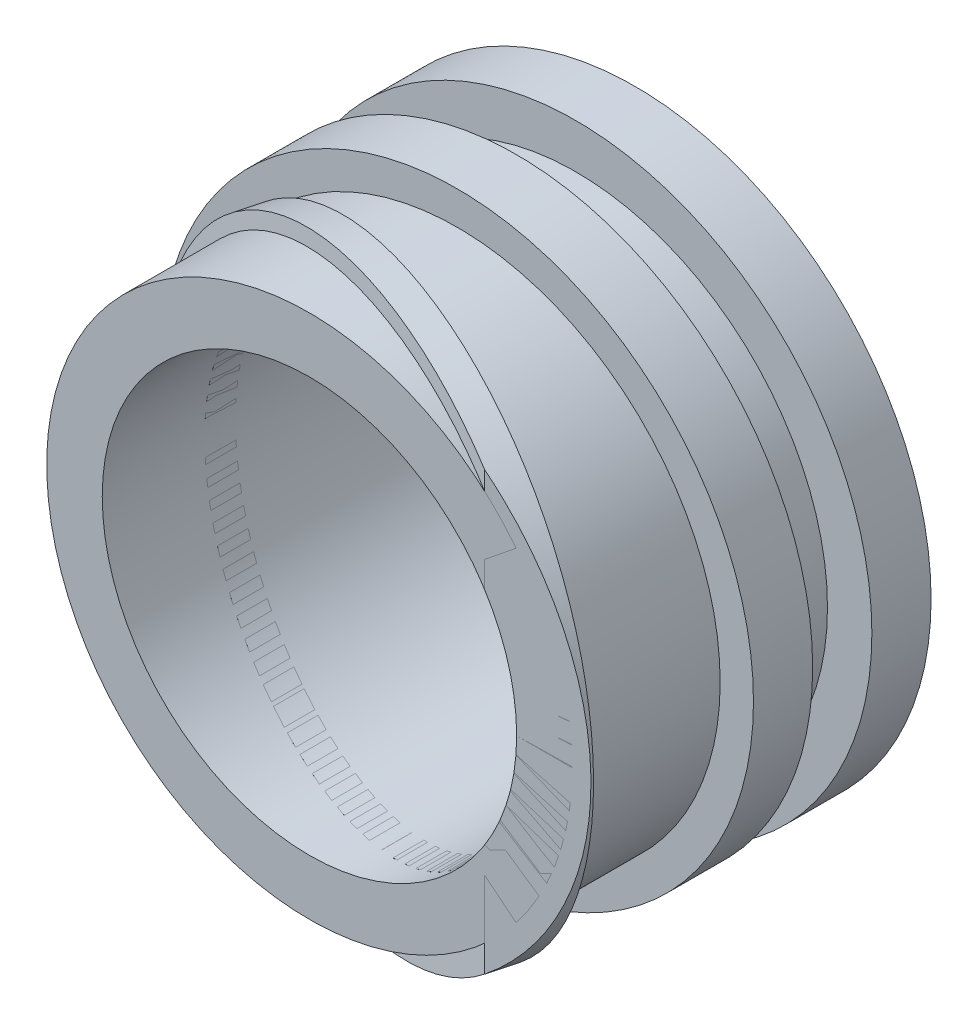
ISO-10303-21;
HEADER;
FILE_DESCRIPTION(('STEP AP214'),'2;1');
FILE_NAME('part.step','',(''),(''),'','','');
FILE_SCHEMA(('AUTOMOTIVE_DESIGN { 1 0 10303 214 1 1 1 1 }'));
ENDSEC;
DATA;
#1=APPLICATION_CONTEXT('core data for automotive mechanical design processes');
#2=APPLICATION_PROTOCOL_DEFINITION('international standard','automotive_design',2000,#1);
#3=PRODUCT_CONTEXT('',#1,'mechanical');
#4=PRODUCT('Part','Part','',(#3));
#5=PRODUCT_RELATED_PRODUCT_CATEGORY('part','',(#4));
#6=PRODUCT_DEFINITION_FORMATION('','',#4);
#7=PRODUCT_DEFINITION_CONTEXT('part definition',#1,'design');
#8=PRODUCT_DEFINITION('design','',#6,#7);
#9=PRODUCT_DEFINITION_SHAPE('','',#8);
#10=(LENGTH_UNIT() NAMED_UNIT(*) SI_UNIT(.MILLI.,.METRE.));
#11=(NAMED_UNIT(*) PLANE_ANGLE_UNIT() SI_UNIT($,.RADIAN.));
#12=(NAMED_UNIT(*) SI_UNIT($,.STERADIAN.) SOLID_ANGLE_UNIT());
#13=UNCERTAINTY_MEASURE_WITH_UNIT(LENGTH_MEASURE(1.E-05),#10,'distance_accuracy_value','');
#14=(GEOMETRIC_REPRESENTATION_CONTEXT(3) GLOBAL_UNCERTAINTY_ASSIGNED_CONTEXT((#13)) GLOBAL_UNIT_ASSIGNED_CONTEXT((#10,
#11,#12)) REPRESENTATION_CONTEXT('',''));
#15=CARTESIAN_POINT('',(0.,0.,0.));
#16=DIRECTION('',(0.,0.,1.));
#17=DIRECTION('',(1.,0.,0.));
#18=AXIS2_PLACEMENT_3D('',#15,#16,#17);
#19=CARTESIAN_POINT('',(0.0136407378455583,-0.133986716540576,9.41698028792618));
#20=DIRECTION('',(-0.258819045102521,0.,0.965925826289068));
#21=DIRECTION('',(0.965925826289068,0.,0.258819045102521));
#22=AXIS2_PLACEMENT_3D('',#19,#20,#21);
#23=PLANE('',#22);
#24=CARTESIAN_POINT('',(0.0136407378455583,-0.133986716540576,9.41698028792618));
#25=DIRECTION('',(-0.258819045102521,0.,0.965925826289068));
#26=DIRECTION('',(0.965925826289068,0.,0.258819045102521));
#27=AXIS2_PLACEMENT_3D('',#24,#25,#26);
#28=CIRCLE('',#27,9.58305954434531);
#29=CARTESIAN_POINT('',(5.92155073268807,7.24338939658348,11.));
#30=VERTEX_POINT('',#29);
#31=CARTESIAN_POINT('',(5.92155073268807,-7.51136282966463,11.));
#32=VERTEX_POINT('',#31);
#33=EDGE_CURVE('E49',#30,#32,#28,.T.);
#34=ORIENTED_EDGE('',*,*,#33,.T.);
#35=DIRECTION('',(0.,1.,0.));
#36=VECTOR('',#35,1.);
#37=CARTESIAN_POINT('',(5.92155073268807,-0.133986716540576,11.));
#38=LINE('',#37,#36);
#39=CARTESIAN_POINT('',(5.92155073268807,-3.73299302439764,11.));
#40=VERTEX_POINT('',#39);
#41=EDGE_CURVE('E60',#32,#40,#38,.T.);
#42=ORIENTED_EDGE('',*,*,#41,.T.);
#43=CARTESIAN_POINT('',(0.,0.,9.4133252632363));
#44=DIRECTION('',(-0.258819045102521,0.,0.965925826289068));
#45=DIRECTION('',(-0.965925826289068,0.,-0.258819045102521));
#46=AXIS2_PLACEMENT_3D('',#43,#44,#45);
#47=ELLIPSE('',#46,7.24693326287058,7.);
#48=CARTESIAN_POINT('',(5.92155073268807,3.73299302439764,11.));
#49=VERTEX_POINT('',#48);
#50=EDGE_CURVE('E71',#40,#49,#47,.F.);
#51=ORIENTED_EDGE('',*,*,#50,.T.);
#52=EDGE_CURVE('E56',#49,#30,#38,.T.);
#53=ORIENTED_EDGE('',*,*,#52,.T.);
#54=EDGE_LOOP('',(#34,#42,#51,#53));
#55=FACE_BOUND('',#54,.T.);
#56=ADVANCED_FACE('F41',(#55),#23,.T.);
#57=CARTESIAN_POINT('',(0.0136407378455583,-0.133986716540576,9.41698028792618));
#58=DIRECTION('',(0.258819045102521,0.,-0.965925826289068));
#59=DIRECTION('',(-0.965925826289068,0.,-0.258819045102521));
#60=AXIS2_PLACEMENT_3D('',#57,#58,#59);
#61=CYLINDRICAL_SURFACE('',#60,9.58305954434531);
#62=CARTESIAN_POINT('',(0.27245978294808,-0.133986716540576,8.45105446163712));
#63=DIRECTION('',(-0.258819045102521,0.,0.965925826289068));
#64=DIRECTION('',(0.965925826289068,0.,0.258819045102521));
#65=AXIS2_PLACEMENT_3D('',#62,#63,#64);
#66=CIRCLE('',#65,9.58305954434531);
#67=CARTESIAN_POINT('',(9.52898449169716,-0.133986716540576,10.9313327820652));
#68=VERTEX_POINT('',#67);
#69=EDGE_CURVE('E76',#68,#68,#66,.T.);
#70=ORIENTED_EDGE('',*,*,#69,.T.);
#71=EDGE_LOOP('',(#70));
#72=FACE_BOUND('',#71,.T.);
#73=CARTESIAN_POINT('',(-0.410528115607169,-0.133986716540576,11.));
#74=DIRECTION('',(0.,0.,1.));
#75=DIRECTION('',(1.,0.,0.));
#76=AXIS2_PLACEMENT_3D('',#73,#74,#75);
#77=ELLIPSE('',#76,9.9211132817122,9.58305954434531);
#78=EDGE_CURVE('E73',#32,#30,#77,.T.);
#79=ORIENTED_EDGE('',*,*,#78,.F.);
#80=ORIENTED_EDGE('',*,*,#33,.F.);
#81=EDGE_LOOP('',(#79,#80));
#82=FACE_BOUND('',#81,.T.);
#83=ADVANCED_FACE('F43',(#72,#82),#61,.T.);
#84=CARTESIAN_POINT('',(0.,0.,11.8972586083542));
#85=DIRECTION('',(0.,0.,-1.));
#86=DIRECTION('',(-1.,0.,0.));
#87=AXIS2_PLACEMENT_3D('',#84,#85,#86);
#88=CYLINDRICAL_SURFACE('',#87,7.);
#89=CARTESIAN_POINT('',(0.,0.,8.37804908282622));
#90=DIRECTION('',(-0.258819045102521,0.,0.965925826289068));
#91=DIRECTION('',(-0.965925826289068,0.,-0.258819045102521));
#92=AXIS2_PLACEMENT_3D('',#89,#90,#91);
#93=ELLIPSE('',#92,7.24693326287058,7.);
#94=CARTESIAN_POINT('',(-7.,0.,6.50240473580835));
#95=VERTEX_POINT('',#94);
#96=EDGE_CURVE('E77',#95,#95,#93,.F.);
#97=ORIENTED_EDGE('',*,*,#96,.T.);
#98=EDGE_LOOP('',(#97));
#99=FACE_BOUND('',#98,.T.);
#100=ORIENTED_EDGE('',*,*,#50,.F.);
#101=CARTESIAN_POINT('',(0.,0.,11.));
#102=DIRECTION('',(0.,0.,1.));
#103=DIRECTION('',(1.,0.,0.));
#104=AXIS2_PLACEMENT_3D('',#101,#102,#103);
#105=CIRCLE('',#104,7.);
#106=EDGE_CURVE('E12',#40,#49,#105,.T.);
#107=ORIENTED_EDGE('',*,*,#106,.T.);
#108=EDGE_LOOP('',(#100,#107));
#109=FACE_BOUND('',#108,.T.);
#110=ADVANCED_FACE('F75',(#99,#109),#88,.F.);
#111=CARTESIAN_POINT('',(0.27245978294808,-0.133986716540576,8.45105446163712));
#112=DIRECTION('',(-0.258819045102521,0.,0.965925826289068));
#113=DIRECTION('',(0.965925826289068,0.,0.258819045102521));
#114=AXIS2_PLACEMENT_3D('',#111,#112,#113);
#115=PLANE('',#114);
#116=ORIENTED_EDGE('',*,*,#69,.F.);
#117=EDGE_LOOP('',(#116));
#118=FACE_BOUND('',#117,.T.);
#119=ORIENTED_EDGE('',*,*,#96,.F.);
#120=EDGE_LOOP('',(#119));
#121=FACE_BOUND('',#120,.T.);
#122=ADVANCED_FACE('F91',(#118,#121),#115,.F.);
#123=CARTESIAN_POINT('',(10.,8.875,11.));
#124=DIRECTION('',(0.,0.,1.));
#125=DIRECTION('',(1.,0.,0.));
#126=AXIS2_PLACEMENT_3D('',#123,#124,#125);
#127=PLANE('',#126);
#128=ORIENTED_EDGE('',*,*,#78,.T.);
#129=ORIENTED_EDGE('',*,*,#52,.F.);
#130=ORIENTED_EDGE('',*,*,#106,.F.);
#131=ORIENTED_EDGE('',*,*,#41,.F.);
#132=EDGE_LOOP('',(#128,#129,#130,#131));
#133=FACE_BOUND('',#132,.T.);
#134=ADVANCED_FACE('F65',(#133),#127,.T.);
#135=CLOSED_SHELL('',(#56,#83,#110,#122,#134));
#136=MANIFOLD_SOLID_BREP('B2',#135);
#137=CARTESIAN_POINT('',(0.,0.,6.));
#138=DIRECTION('',(0.,0.,1.));
#139=DIRECTION('',(1.,0.,0.));
#140=AXIS2_PLACEMENT_3D('',#137,#138,#139);
#141=PLANE('',#140);
#142=CARTESIAN_POINT('',(0.,0.,6.));
#143=DIRECTION('',(0.,0.,1.));
#144=DIRECTION('',(1.,0.,0.));
#145=AXIS2_PLACEMENT_3D('',#142,#143,#144);
#146=CIRCLE('',#145,10.);
#147=CARTESIAN_POINT('',(10.,0.,6.));
#148=VERTEX_POINT('',#147);
#149=EDGE_CURVE('E153',#148,#148,#146,.T.);
#150=ORIENTED_EDGE('',*,*,#149,.T.);
#151=EDGE_LOOP('',(#150));
#152=FACE_BOUND('',#151,.T.);
#153=CARTESIAN_POINT('',(0.,0.,6.));
#154=DIRECTION('',(0.,0.,1.));
#155=DIRECTION('',(1.,0.,0.));
#156=AXIS2_PLACEMENT_3D('',#153,#154,#155);
#157=CIRCLE('',#156,8.875);
#158=CARTESIAN_POINT('',(8.875,0.,6.));
#159=VERTEX_POINT('',#158);
#160=EDGE_CURVE('E163',#159,#159,#157,.T.);
#161=ORIENTED_EDGE('',*,*,#160,.F.);
#162=EDGE_LOOP('',(#161));
#163=FACE_BOUND('',#162,.T.);
#164=ADVANCED_FACE('F133',(#152,#163),#141,.T.);
#165=CARTESIAN_POINT('',(0.,0.,0.));
#166=DIRECTION('',(0.,0.,1.));
#167=DIRECTION('',(1.,0.,0.));
#168=AXIS2_PLACEMENT_3D('',#165,#166,#167);
#169=PLANE('',#168);
#170=CARTESIAN_POINT('',(0.,0.,0.));
#171=DIRECTION('',(0.,0.,1.));
#172=DIRECTION('',(1.,0.,0.));
#173=AXIS2_PLACEMENT_3D('',#170,#171,#172);
#174=CIRCLE('',#173,10.);
#175=CARTESIAN_POINT('',(10.,0.,0.));
#176=VERTEX_POINT('',#175);
#177=EDGE_CURVE('E144',#176,#176,#174,.T.);
#178=ORIENTED_EDGE('',*,*,#177,.F.);
#179=EDGE_LOOP('',(#178));
#180=FACE_BOUND('',#179,.T.);
#181=CARTESIAN_POINT('',(0.,0.,0.));
#182=DIRECTION('',(0.,0.,1.));
#183=DIRECTION('',(1.,0.,0.));
#184=AXIS2_PLACEMENT_3D('',#181,#182,#183);
#185=CIRCLE('',#184,7.);
#186=CARTESIAN_POINT('',(7.,0.,0.));
#187=VERTEX_POINT('',#186);
#188=EDGE_CURVE('E157',#187,#187,#185,.T.);
#189=ORIENTED_EDGE('',*,*,#188,.T.);
#190=EDGE_LOOP('',(#189));
#191=FACE_BOUND('',#190,.T.);
#192=ADVANCED_FACE('F187',(#180,#191),#169,.F.);
#193=CARTESIAN_POINT('',(0.,0.,6.));
#194=DIRECTION('',(0.,0.,-1.));
#195=DIRECTION('',(-1.,0.,0.));
#196=AXIS2_PLACEMENT_3D('',#193,#194,#195);
#197=CYLINDRICAL_SURFACE('',#196,8.5);
#198=CARTESIAN_POINT('',(0.,0.,2.));
#199=DIRECTION('',(0.,0.,1.));
#200=DIRECTION('',(1.,0.,0.));
#201=AXIS2_PLACEMENT_3D('',#198,#199,#200);
#202=CIRCLE('',#201,8.5);
#203=CARTESIAN_POINT('',(8.5,0.,2.));
#204=VERTEX_POINT('',#203);
#205=EDGE_CURVE('E149',#204,#204,#202,.F.);
#206=ORIENTED_EDGE('',*,*,#205,.F.);
#207=EDGE_LOOP('',(#206));
#208=FACE_BOUND('',#207,.T.);
#209=CARTESIAN_POINT('',(0.,0.,4.));
#210=DIRECTION('',(0.,0.,1.));
#211=DIRECTION('',(1.,0.,0.));
#212=AXIS2_PLACEMENT_3D('',#209,#210,#211);
#213=CIRCLE('',#212,8.5);
#214=CARTESIAN_POINT('',(8.5,0.,4.));
#215=VERTEX_POINT('',#214);
#216=EDGE_CURVE('E40',#215,#215,#213,.T.);
#217=ORIENTED_EDGE('',*,*,#216,.F.);
#218=EDGE_LOOP('',(#217));
#219=FACE_BOUND('',#218,.T.);
#220=ADVANCED_FACE('F193',(#208,#219),#197,.T.);
#221=CARTESIAN_POINT('',(0.,0.,2.));
#222=DIRECTION('',(0.,0.,1.));
#223=DIRECTION('',(1.,0.,0.));
#224=AXIS2_PLACEMENT_3D('',#221,#222,#223);
#225=PLANE('',#224);
#226=CARTESIAN_POINT('',(0.,0.,2.));
#227=DIRECTION('',(0.,0.,1.));
#228=DIRECTION('',(1.,0.,0.));
#229=AXIS2_PLACEMENT_3D('',#226,#227,#228);
#230=CIRCLE('',#229,10.);
#231=CARTESIAN_POINT('',(10.,0.,2.));
#232=VERTEX_POINT('',#231);
#233=EDGE_CURVE('E140',#232,#232,#230,.T.);
#234=ORIENTED_EDGE('',*,*,#233,.T.);
#235=EDGE_LOOP('',(#234));
#236=FACE_BOUND('',#235,.T.);
#237=ORIENTED_EDGE('',*,*,#205,.T.);
#238=EDGE_LOOP('',(#237));
#239=FACE_BOUND('',#238,.T.);
#240=ADVANCED_FACE('F201',(#236,#239),#225,.T.);
#241=CARTESIAN_POINT('',(0.,0.,2.));
#242=DIRECTION('',(0.,0.,-1.));
#243=DIRECTION('',(-1.,0.,0.));
#244=AXIS2_PLACEMENT_3D('',#241,#242,#243);
#245=CYLINDRICAL_SURFACE('',#244,10.);
#246=ORIENTED_EDGE('',*,*,#233,.F.);
#247=EDGE_LOOP('',(#246));
#248=FACE_BOUND('',#247,.T.);
#249=ORIENTED_EDGE('',*,*,#177,.T.);
#250=EDGE_LOOP('',(#249));
#251=FACE_BOUND('',#250,.T.);
#252=ADVANCED_FACE('F135',(#248,#251),#245,.T.);
#253=CARTESIAN_POINT('',(0.,0.,4.));
#254=DIRECTION('',(0.,0.,1.));
#255=DIRECTION('',(1.,0.,0.));
#256=AXIS2_PLACEMENT_3D('',#253,#254,#255);
#257=PLANE('',#256);
#258=CARTESIAN_POINT('',(0.,0.,4.));
#259=DIRECTION('',(0.,0.,1.));
#260=DIRECTION('',(1.,0.,0.));
#261=AXIS2_PLACEMENT_3D('',#258,#259,#260);
#262=CIRCLE('',#261,10.);
#263=CARTESIAN_POINT('',(10.,0.,4.));
#264=VERTEX_POINT('',#263);
#265=EDGE_CURVE('E154',#264,#264,#262,.T.);
#266=ORIENTED_EDGE('',*,*,#265,.F.);
#267=EDGE_LOOP('',(#266));
#268=FACE_BOUND('',#267,.T.);
#269=ORIENTED_EDGE('',*,*,#216,.T.);
#270=EDGE_LOOP('',(#269));
#271=FACE_BOUND('',#270,.T.);
#272=ADVANCED_FACE('F207',(#268,#271),#257,.F.);
#273=CARTESIAN_POINT('',(0.,0.,6.));
#274=DIRECTION('',(0.,0.,-1.));
#275=DIRECTION('',(-1.,0.,0.));
#276=AXIS2_PLACEMENT_3D('',#273,#274,#275);
#277=CYLINDRICAL_SURFACE('',#276,10.);
#278=ORIENTED_EDGE('',*,*,#149,.F.);
#279=EDGE_LOOP('',(#278));
#280=FACE_BOUND('',#279,.T.);
#281=ORIENTED_EDGE('',*,*,#265,.T.);
#282=EDGE_LOOP('',(#281));
#283=FACE_BOUND('',#282,.T.);
#284=ADVANCED_FACE('F197',(#280,#283),#277,.T.);
#285=CARTESIAN_POINT('',(0.,0.,6.));
#286=DIRECTION('',(0.,0.,-1.));
#287=DIRECTION('',(-1.,0.,0.));
#288=AXIS2_PLACEMENT_3D('',#285,#286,#287);
#289=CYLINDRICAL_SURFACE('',#288,7.);
#290=ORIENTED_EDGE('',*,*,#188,.F.);
#291=EDGE_LOOP('',(#290));
#292=FACE_BOUND('',#291,.T.);
#293=CARTESIAN_POINT('',(0.,0.,11.));
#294=DIRECTION('',(0.,0.,1.));
#295=DIRECTION('',(1.,0.,0.));
#296=AXIS2_PLACEMENT_3D('',#293,#294,#295);
#297=CIRCLE('',#296,7.);
#298=CARTESIAN_POINT('',(7.,0.,11.));
#299=VERTEX_POINT('',#298);
#300=EDGE_CURVE('E166',#299,#299,#297,.T.);
#301=ORIENTED_EDGE('',*,*,#300,.T.);
#302=EDGE_LOOP('',(#301));
#303=FACE_BOUND('',#302,.T.);
#304=ADVANCED_FACE('F172',(#292,#303),#289,.F.);
#305=CARTESIAN_POINT('',(0.,0.,11.));
#306=DIRECTION('',(0.,0.,1.));
#307=DIRECTION('',(1.,0.,0.));
#308=AXIS2_PLACEMENT_3D('',#305,#306,#307);
#309=PLANE('',#308);
#310=ORIENTED_EDGE('',*,*,#300,.F.);
#311=EDGE_LOOP('',(#310));
#312=FACE_BOUND('',#311,.T.);
#313=CARTESIAN_POINT('',(0.,0.,11.));
#314=DIRECTION('',(0.,0.,1.));
#315=DIRECTION('',(1.,0.,0.));
#316=AXIS2_PLACEMENT_3D('',#313,#314,#315);
#317=CIRCLE('',#316,8.875);
#318=CARTESIAN_POINT('',(8.875,0.,11.));
#319=VERTEX_POINT('',#318);
#320=EDGE_CURVE('E162',#319,#319,#317,.T.);
#321=ORIENTED_EDGE('',*,*,#320,.T.);
#322=EDGE_LOOP('',(#321));
#323=FACE_BOUND('',#322,.T.);
#324=ADVANCED_FACE('F174',(#312,#323),#309,.T.);
#325=CARTESIAN_POINT('',(0.,0.,11.));
#326=DIRECTION('',(0.,0.,-1.));
#327=DIRECTION('',(-1.,0.,0.));
#328=AXIS2_PLACEMENT_3D('',#325,#326,#327);
#329=CYLINDRICAL_SURFACE('',#328,8.875);
#330=ORIENTED_EDGE('',*,*,#320,.F.);
#331=EDGE_LOOP('',(#330));
#332=FACE_BOUND('',#331,.T.);
#333=ORIENTED_EDGE('',*,*,#160,.T.);
#334=EDGE_LOOP('',(#333));
#335=FACE_BOUND('',#334,.T.);
#336=ADVANCED_FACE('F177',(#332,#335),#329,.T.);
#337=CLOSED_SHELL('',(#164,#192,#220,#240,#252,#272,#284,#304,#324,#336));
#338=MANIFOLD_SOLID_BREP('B6',#337);
#339=ADVANCED_BREP_SHAPE_REPRESENTATION('',(#18,#136,#338),#14);
#340=SHAPE_DEFINITION_REPRESENTATION(#9,#339);
ENDSEC;
END-ISO-10303-21;
